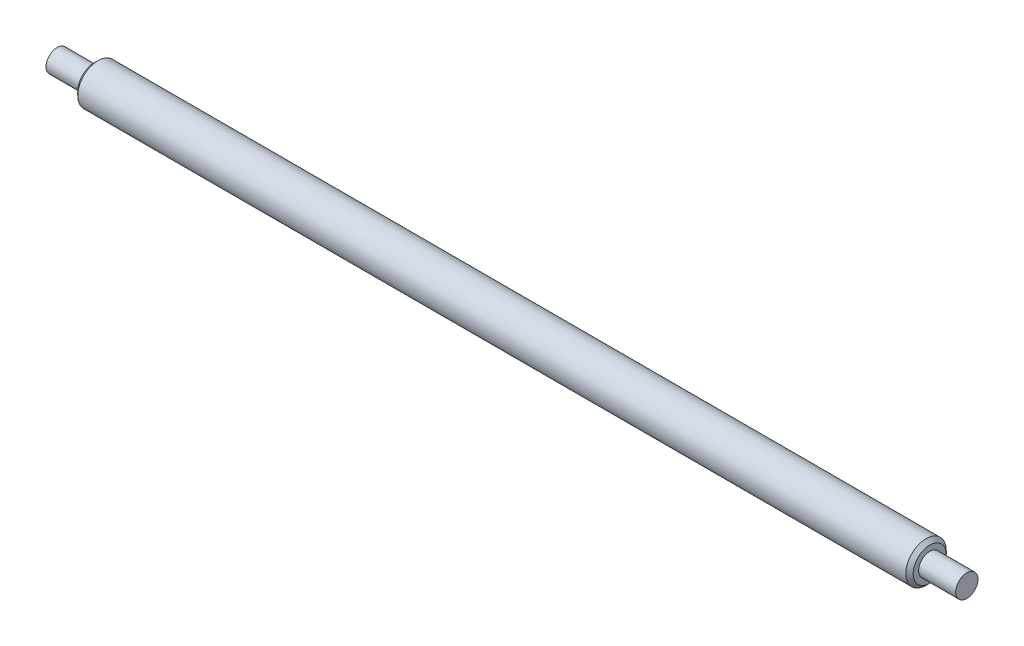
ISO-10303-21;
HEADER;
FILE_DESCRIPTION(('STEP AP214'),'2;1');
FILE_NAME('part.step','',(''),(''),'','','');
FILE_SCHEMA(('AUTOMOTIVE_DESIGN { 1 0 10303 214 1 1 1 1 }'));
ENDSEC;
DATA;
#1=APPLICATION_CONTEXT('core data for automotive mechanical design processes');
#2=APPLICATION_PROTOCOL_DEFINITION('international standard','automotive_design',2000,#1);
#3=PRODUCT_CONTEXT('',#1,'mechanical');
#4=PRODUCT('Part','Part','',(#3));
#5=PRODUCT_RELATED_PRODUCT_CATEGORY('part','',(#4));
#6=PRODUCT_DEFINITION_FORMATION('','',#4);
#7=PRODUCT_DEFINITION_CONTEXT('part definition',#1,'design');
#8=PRODUCT_DEFINITION('design','',#6,#7);
#9=PRODUCT_DEFINITION_SHAPE('','',#8);
#10=(LENGTH_UNIT() NAMED_UNIT(*) SI_UNIT(.MILLI.,.METRE.));
#11=(NAMED_UNIT(*) PLANE_ANGLE_UNIT() SI_UNIT($,.RADIAN.));
#12=(NAMED_UNIT(*) SI_UNIT($,.STERADIAN.) SOLID_ANGLE_UNIT());
#13=UNCERTAINTY_MEASURE_WITH_UNIT(LENGTH_MEASURE(1.E-05),#10,'distance_accuracy_value','');
#14=(GEOMETRIC_REPRESENTATION_CONTEXT(3) GLOBAL_UNCERTAINTY_ASSIGNED_CONTEXT((#13)) GLOBAL_UNIT_ASSIGNED_CONTEXT((#10,
#11,#12)) REPRESENTATION_CONTEXT('',''));
#15=CARTESIAN_POINT('',(0.,0.,0.));
#16=DIRECTION('',(0.,0.,1.));
#17=DIRECTION('',(1.,0.,0.));
#18=AXIS2_PLACEMENT_3D('',#15,#16,#17);
#19=CARTESIAN_POINT('',(245.,0.,0.));
#20=DIRECTION('',(-1.,0.,0.));
#21=DIRECTION('',(0.,0.,1.));
#22=AXIS2_PLACEMENT_3D('',#19,#20,#21);
#23=CYLINDRICAL_SURFACE('',#22,10.9);
#24=CARTESIAN_POINT('',(-223.,0.,0.));
#25=DIRECTION('',(-1.,0.,0.));
#26=DIRECTION('',(0.,0.,1.));
#27=AXIS2_PLACEMENT_3D('',#24,#25,#26);
#28=CIRCLE('',#27,10.9);
#29=CARTESIAN_POINT('',(-223.,0.,10.9));
#30=VERTEX_POINT('',#29);
#31=EDGE_CURVE('E45',#30,#30,#28,.F.);
#32=ORIENTED_EDGE('',*,*,#31,.T.);
#33=EDGE_LOOP('',(#32));
#34=FACE_BOUND('',#33,.T.);
#35=CARTESIAN_POINT('',(223.,0.,0.));
#36=DIRECTION('',(1.,0.,0.));
#37=DIRECTION('',(0.,0.,-1.));
#38=AXIS2_PLACEMENT_3D('',#35,#36,#37);
#39=CIRCLE('',#38,10.9);
#40=CARTESIAN_POINT('',(223.,0.,-10.9));
#41=VERTEX_POINT('',#40);
#42=EDGE_CURVE('E49',#41,#41,#39,.F.);
#43=ORIENTED_EDGE('',*,*,#42,.T.);
#44=EDGE_LOOP('',(#43));
#45=FACE_BOUND('',#44,.T.);
#46=ADVANCED_FACE('F37',(#34,#45),#23,.T.);
#47=CARTESIAN_POINT('',(225.,0.,0.));
#48=DIRECTION('',(1.,0.,0.));
#49=DIRECTION('',(0.,0.,-1.));
#50=AXIS2_PLACEMENT_3D('',#47,#48,#49);
#51=PLANE('',#50);
#52=CARTESIAN_POINT('',(225.,0.,0.));
#53=DIRECTION('',(1.,0.,0.));
#54=DIRECTION('',(0.,0.,-1.));
#55=AXIS2_PLACEMENT_3D('',#52,#53,#54);
#56=CIRCLE('',#55,8.90000000000007);
#57=CARTESIAN_POINT('',(225.,0.,-8.90000000000007));
#58=VERTEX_POINT('',#57);
#59=EDGE_CURVE('E10',#58,#58,#56,.T.);
#60=ORIENTED_EDGE('',*,*,#59,.T.);
#61=EDGE_LOOP('',(#60));
#62=FACE_BOUND('',#61,.T.);
#63=CARTESIAN_POINT('',(225.,0.,0.));
#64=DIRECTION('',(1.,0.,0.));
#65=DIRECTION('',(0.,0.,-1.));
#66=AXIS2_PLACEMENT_3D('',#63,#64,#65);
#67=CIRCLE('',#66,6.);
#68=CARTESIAN_POINT('',(225.,0.,-6.));
#69=VERTEX_POINT('',#68);
#70=EDGE_CURVE('E58',#69,#69,#67,.T.);
#71=ORIENTED_EDGE('',*,*,#70,.F.);
#72=EDGE_LOOP('',(#71));
#73=FACE_BOUND('',#72,.T.);
#74=ADVANCED_FACE('F90',(#62,#73),#51,.T.);
#75=CARTESIAN_POINT('',(225.,0.,0.));
#76=DIRECTION('',(1.,0.,0.));
#77=DIRECTION('',(0.,0.,-1.));
#78=AXIS2_PLACEMENT_3D('',#75,#76,#77);
#79=CYLINDRICAL_SURFACE('',#78,6.);
#80=ORIENTED_EDGE('',*,*,#70,.T.);
#81=EDGE_LOOP('',(#80));
#82=FACE_BOUND('',#81,.T.);
#83=CARTESIAN_POINT('',(245.,0.,0.));
#84=DIRECTION('',(1.,0.,0.));
#85=DIRECTION('',(0.,0.,-1.));
#86=AXIS2_PLACEMENT_3D('',#83,#84,#85);
#87=CIRCLE('',#86,6.);
#88=CARTESIAN_POINT('',(245.,0.,-6.));
#89=VERTEX_POINT('',#88);
#90=EDGE_CURVE('E59',#89,#89,#87,.T.);
#91=ORIENTED_EDGE('',*,*,#90,.F.);
#92=EDGE_LOOP('',(#91));
#93=FACE_BOUND('',#92,.T.);
#94=ADVANCED_FACE('F85',(#82,#93),#79,.T.);
#95=CARTESIAN_POINT('',(245.,0.,0.));
#96=DIRECTION('',(1.,0.,0.));
#97=DIRECTION('',(0.,0.,-1.));
#98=AXIS2_PLACEMENT_3D('',#95,#96,#97);
#99=PLANE('',#98);
#100=ORIENTED_EDGE('',*,*,#90,.T.);
#101=EDGE_LOOP('',(#100));
#102=FACE_BOUND('',#101,.T.);
#103=ADVANCED_FACE('F76',(#102),#99,.T.);
#104=CARTESIAN_POINT('',(-225.,0.,0.));
#105=DIRECTION('',(-1.,0.,0.));
#106=DIRECTION('',(0.,0.,1.));
#107=AXIS2_PLACEMENT_3D('',#104,#105,#106);
#108=PLANE('',#107);
#109=CARTESIAN_POINT('',(-225.,0.,0.));
#110=DIRECTION('',(-1.,0.,0.));
#111=DIRECTION('',(0.,0.,1.));
#112=AXIS2_PLACEMENT_3D('',#109,#110,#111);
#113=CIRCLE('',#112,8.89999999999994);
#114=CARTESIAN_POINT('',(-225.,0.,8.89999999999994));
#115=VERTEX_POINT('',#114);
#116=EDGE_CURVE('E53',#115,#115,#113,.T.);
#117=ORIENTED_EDGE('',*,*,#116,.T.);
#118=EDGE_LOOP('',(#117));
#119=FACE_BOUND('',#118,.T.);
#120=CARTESIAN_POINT('',(-225.,0.,0.));
#121=DIRECTION('',(-1.,0.,0.));
#122=DIRECTION('',(0.,0.,1.));
#123=AXIS2_PLACEMENT_3D('',#120,#121,#122);
#124=CIRCLE('',#123,6.);
#125=CARTESIAN_POINT('',(-225.,0.,6.));
#126=VERTEX_POINT('',#125);
#127=EDGE_CURVE('E62',#126,#126,#124,.T.);
#128=ORIENTED_EDGE('',*,*,#127,.F.);
#129=EDGE_LOOP('',(#128));
#130=FACE_BOUND('',#129,.T.);
#131=ADVANCED_FACE('F74',(#119,#130),#108,.T.);
#132=CARTESIAN_POINT('',(-225.,0.,0.));
#133=DIRECTION('',(-1.,0.,0.));
#134=DIRECTION('',(0.,0.,1.));
#135=AXIS2_PLACEMENT_3D('',#132,#133,#134);
#136=CYLINDRICAL_SURFACE('',#135,6.);
#137=ORIENTED_EDGE('',*,*,#127,.T.);
#138=EDGE_LOOP('',(#137));
#139=FACE_BOUND('',#138,.T.);
#140=CARTESIAN_POINT('',(-245.,0.,0.));
#141=DIRECTION('',(-1.,0.,0.));
#142=DIRECTION('',(0.,0.,1.));
#143=AXIS2_PLACEMENT_3D('',#140,#141,#142);
#144=CIRCLE('',#143,6.);
#145=CARTESIAN_POINT('',(-245.,0.,6.));
#146=VERTEX_POINT('',#145);
#147=EDGE_CURVE('E65',#146,#146,#144,.T.);
#148=ORIENTED_EDGE('',*,*,#147,.F.);
#149=EDGE_LOOP('',(#148));
#150=FACE_BOUND('',#149,.T.);
#151=ADVANCED_FACE('F71',(#139,#150),#136,.T.);
#152=CARTESIAN_POINT('',(-245.,0.,0.));
#153=DIRECTION('',(1.,0.,0.));
#154=DIRECTION('',(0.,0.,-1.));
#155=AXIS2_PLACEMENT_3D('',#152,#153,#154);
#156=PLANE('',#155);
#157=ORIENTED_EDGE('',*,*,#147,.T.);
#158=EDGE_LOOP('',(#157));
#159=FACE_BOUND('',#158,.T.);
#160=ADVANCED_FACE('F83',(#159),#156,.F.);
#161=CARTESIAN_POINT('',(-225.,0.,0.));
#162=DIRECTION('',(1.,0.,0.));
#163=DIRECTION('',(0.,0.,-1.));
#164=AXIS2_PLACEMENT_3D('',#161,#162,#163);
#165=CONICAL_SURFACE('',#164,8.89999999999996,0.785398163397443);
#166=ORIENTED_EDGE('',*,*,#31,.F.);
#167=EDGE_LOOP('',(#166));
#168=FACE_BOUND('',#167,.T.);
#169=ORIENTED_EDGE('',*,*,#116,.F.);
#170=EDGE_LOOP('',(#169));
#171=FACE_BOUND('',#170,.T.);
#172=ADVANCED_FACE('F99',(#168,#171),#165,.T.);
#173=CARTESIAN_POINT('',(225.,0.,0.));
#174=DIRECTION('',(-1.,0.,0.));
#175=DIRECTION('',(0.,0.,1.));
#176=AXIS2_PLACEMENT_3D('',#173,#174,#175);
#177=CONICAL_SURFACE('',#176,8.90000000000007,0.785398163397436);
#178=ORIENTED_EDGE('',*,*,#42,.F.);
#179=EDGE_LOOP('',(#178));
#180=FACE_BOUND('',#179,.T.);
#181=ORIENTED_EDGE('',*,*,#59,.F.);
#182=EDGE_LOOP('',(#181));
#183=FACE_BOUND('',#182,.T.);
#184=ADVANCED_FACE('F40',(#180,#183),#177,.T.);
#185=CLOSED_SHELL('',(#46,#74,#94,#103,#131,#151,#160,#172,#184));
#186=MANIFOLD_SOLID_BREP('B2',#185);
#187=ADVANCED_BREP_SHAPE_REPRESENTATION('',(#18,#186),#14);
#188=SHAPE_DEFINITION_REPRESENTATION(#9,#187);
ENDSEC;
END-ISO-10303-21;
